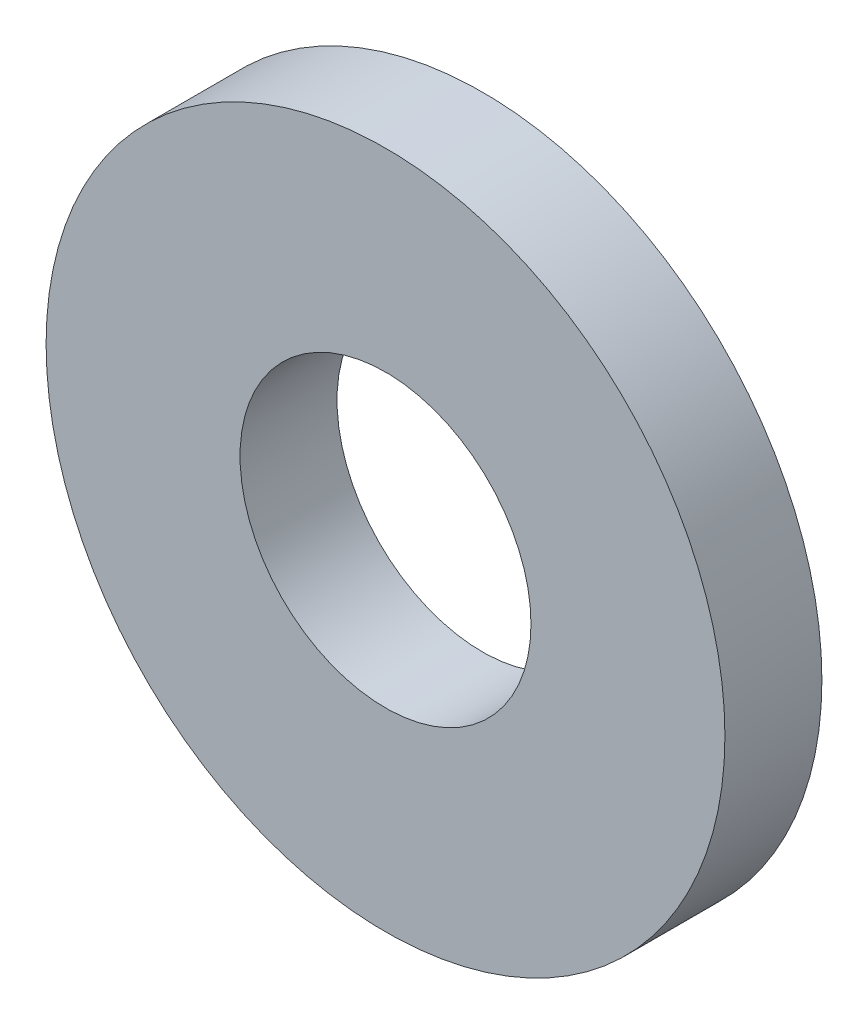
ISO-10303-21;
HEADER;
FILE_DESCRIPTION(('STEP AP214'),'2;1');
FILE_NAME('part.step','',(''),(''),'','','');
FILE_SCHEMA(('AUTOMOTIVE_DESIGN { 1 0 10303 214 1 1 1 1 }'));
ENDSEC;
DATA;
#1=APPLICATION_CONTEXT('core data for automotive mechanical design processes');
#2=APPLICATION_PROTOCOL_DEFINITION('international standard','automotive_design',2000,#1);
#3=PRODUCT_CONTEXT('',#1,'mechanical');
#4=PRODUCT('Part','Part','',(#3));
#5=PRODUCT_RELATED_PRODUCT_CATEGORY('part','',(#4));
#6=PRODUCT_DEFINITION_FORMATION('','',#4);
#7=PRODUCT_DEFINITION_CONTEXT('part definition',#1,'design');
#8=PRODUCT_DEFINITION('design','',#6,#7);
#9=PRODUCT_DEFINITION_SHAPE('','',#8);
#10=(LENGTH_UNIT() NAMED_UNIT(*) SI_UNIT(.MILLI.,.METRE.));
#11=(NAMED_UNIT(*) PLANE_ANGLE_UNIT() SI_UNIT($,.RADIAN.));
#12=(NAMED_UNIT(*) SI_UNIT($,.STERADIAN.) SOLID_ANGLE_UNIT());
#13=UNCERTAINTY_MEASURE_WITH_UNIT(LENGTH_MEASURE(1.E-05),#10,'distance_accuracy_value','');
#14=(GEOMETRIC_REPRESENTATION_CONTEXT(3) GLOBAL_UNCERTAINTY_ASSIGNED_CONTEXT((#13)) GLOBAL_UNIT_ASSIGNED_CONTEXT((#10,
#11,#12)) REPRESENTATION_CONTEXT('',''));
#15=CARTESIAN_POINT('',(0.,0.,0.));
#16=DIRECTION('',(0.,0.,1.));
#17=DIRECTION('',(1.,0.,0.));
#18=AXIS2_PLACEMENT_3D('',#15,#16,#17);
#19=CARTESIAN_POINT('',(0.,0.,1.));
#20=DIRECTION('',(0.,0.,1.));
#21=DIRECTION('',(1.,0.,0.));
#22=AXIS2_PLACEMENT_3D('',#19,#20,#21);
#23=PLANE('',#22);
#24=CARTESIAN_POINT('',(0.,0.,1.));
#25=DIRECTION('',(0.,0.,1.));
#26=DIRECTION('',(1.,0.,0.));
#27=AXIS2_PLACEMENT_3D('',#24,#25,#26);
#28=CIRCLE('',#27,7.);
#29=CARTESIAN_POINT('',(7.,0.,1.));
#30=VERTEX_POINT('',#29);
#31=EDGE_CURVE('E10',#30,#30,#28,.T.);
#32=ORIENTED_EDGE('',*,*,#31,.T.);
#33=EDGE_LOOP('',(#32));
#34=FACE_BOUND('',#33,.T.);
#35=CARTESIAN_POINT('',(0.,0.,1.));
#36=DIRECTION('',(0.,0.,1.));
#37=DIRECTION('',(1.,0.,0.));
#38=AXIS2_PLACEMENT_3D('',#35,#36,#37);
#39=CIRCLE('',#38,3.);
#40=CARTESIAN_POINT('',(3.,0.,1.));
#41=VERTEX_POINT('',#40);
#42=EDGE_CURVE('E44',#41,#41,#39,.T.);
#43=ORIENTED_EDGE('',*,*,#42,.F.);
#44=EDGE_LOOP('',(#43));
#45=FACE_BOUND('',#44,.T.);
#46=ADVANCED_FACE('F33',(#34,#45),#23,.T.);
#47=CARTESIAN_POINT('',(0.,0.,-1.));
#48=DIRECTION('',(0.,0.,1.));
#49=DIRECTION('',(1.,0.,0.));
#50=AXIS2_PLACEMENT_3D('',#47,#48,#49);
#51=PLANE('',#50);
#52=CARTESIAN_POINT('',(0.,0.,-1.));
#53=DIRECTION('',(0.,0.,1.));
#54=DIRECTION('',(1.,0.,0.));
#55=AXIS2_PLACEMENT_3D('',#52,#53,#54);
#56=CIRCLE('',#55,7.);
#57=CARTESIAN_POINT('',(7.,0.,-1.));
#58=VERTEX_POINT('',#57);
#59=EDGE_CURVE('E37',#58,#58,#56,.T.);
#60=ORIENTED_EDGE('',*,*,#59,.F.);
#61=EDGE_LOOP('',(#60));
#62=FACE_BOUND('',#61,.T.);
#63=CARTESIAN_POINT('',(0.,0.,-1.));
#64=DIRECTION('',(0.,0.,1.));
#65=DIRECTION('',(1.,0.,0.));
#66=AXIS2_PLACEMENT_3D('',#63,#64,#65);
#67=CIRCLE('',#66,3.);
#68=CARTESIAN_POINT('',(3.,0.,-1.));
#69=VERTEX_POINT('',#68);
#70=EDGE_CURVE('E46',#69,#69,#67,.T.);
#71=ORIENTED_EDGE('',*,*,#70,.T.);
#72=EDGE_LOOP('',(#71));
#73=FACE_BOUND('',#72,.T.);
#74=ADVANCED_FACE('F56',(#62,#73),#51,.F.);
#75=CARTESIAN_POINT('',(0.,0.,1.));
#76=DIRECTION('',(0.,0.,-1.));
#77=DIRECTION('',(-1.,0.,0.));
#78=AXIS2_PLACEMENT_3D('',#75,#76,#77);
#79=CYLINDRICAL_SURFACE('',#78,7.);
#80=ORIENTED_EDGE('',*,*,#31,.F.);
#81=EDGE_LOOP('',(#80));
#82=FACE_BOUND('',#81,.T.);
#83=ORIENTED_EDGE('',*,*,#59,.T.);
#84=EDGE_LOOP('',(#83));
#85=FACE_BOUND('',#84,.T.);
#86=ADVANCED_FACE('F35',(#82,#85),#79,.T.);
#87=CARTESIAN_POINT('',(0.,0.,1.));
#88=DIRECTION('',(0.,0.,-1.));
#89=DIRECTION('',(-1.,0.,0.));
#90=AXIS2_PLACEMENT_3D('',#87,#88,#89);
#91=CYLINDRICAL_SURFACE('',#90,3.);
#92=ORIENTED_EDGE('',*,*,#42,.T.);
#93=EDGE_LOOP('',(#92));
#94=FACE_BOUND('',#93,.T.);
#95=ORIENTED_EDGE('',*,*,#70,.F.);
#96=EDGE_LOOP('',(#95));
#97=FACE_BOUND('',#96,.T.);
#98=ADVANCED_FACE('F52',(#94,#97),#91,.F.);
#99=CLOSED_SHELL('',(#46,#74,#86,#98));
#100=MANIFOLD_SOLID_BREP('B2',#99);
#101=ADVANCED_BREP_SHAPE_REPRESENTATION('',(#18,#100),#14);
#102=SHAPE_DEFINITION_REPRESENTATION(#9,#101);
ENDSEC;
END-ISO-10303-21;
